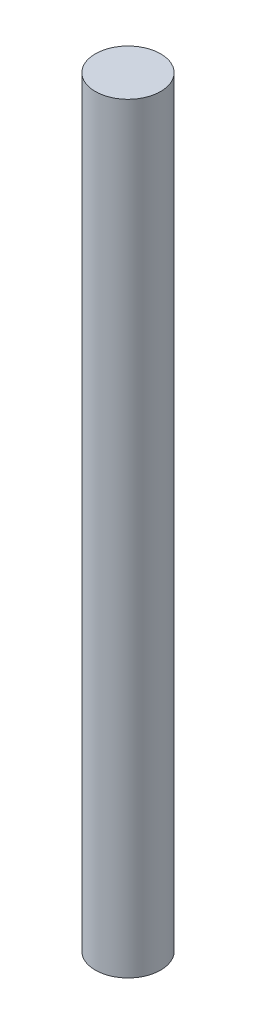
ISO-10303-21;
HEADER;
FILE_DESCRIPTION(('STEP AP214'),'2;1');
FILE_NAME('part.step','',(''),(''),'','','');
FILE_SCHEMA(('AUTOMOTIVE_DESIGN { 1 0 10303 214 1 1 1 1 }'));
ENDSEC;
DATA;
#1=APPLICATION_CONTEXT('core data for automotive mechanical design processes');
#2=APPLICATION_PROTOCOL_DEFINITION('international standard','automotive_design',2000,#1);
#3=PRODUCT_CONTEXT('',#1,'mechanical');
#4=PRODUCT('Part','Part','',(#3));
#5=PRODUCT_RELATED_PRODUCT_CATEGORY('part','',(#4));
#6=PRODUCT_DEFINITION_FORMATION('','',#4);
#7=PRODUCT_DEFINITION_CONTEXT('part definition',#1,'design');
#8=PRODUCT_DEFINITION('design','',#6,#7);
#9=PRODUCT_DEFINITION_SHAPE('','',#8);
#10=(LENGTH_UNIT() NAMED_UNIT(*) SI_UNIT(.MILLI.,.METRE.));
#11=(NAMED_UNIT(*) PLANE_ANGLE_UNIT() SI_UNIT($,.RADIAN.));
#12=(NAMED_UNIT(*) SI_UNIT($,.STERADIAN.) SOLID_ANGLE_UNIT());
#13=UNCERTAINTY_MEASURE_WITH_UNIT(LENGTH_MEASURE(1.E-05),#10,'distance_accuracy_value','');
#14=(GEOMETRIC_REPRESENTATION_CONTEXT(3) GLOBAL_UNCERTAINTY_ASSIGNED_CONTEXT((#13)) GLOBAL_UNIT_ASSIGNED_CONTEXT((#10,
#11,#12)) REPRESENTATION_CONTEXT('',''));
#15=CARTESIAN_POINT('',(0.,0.,0.));
#16=DIRECTION('',(0.,0.,1.));
#17=DIRECTION('',(1.,0.,0.));
#18=AXIS2_PLACEMENT_3D('',#15,#16,#17);
#19=CARTESIAN_POINT('',(0.,37.,0.));
#20=DIRECTION('',(0.,-1.,0.));
#21=DIRECTION('',(0.,0.,-1.));
#22=AXIS2_PLACEMENT_3D('',#19,#20,#21);
#23=CYLINDRICAL_SURFACE('',#22,1.5875);
#24=CARTESIAN_POINT('',(0.,37.,0.));
#25=DIRECTION('',(0.,1.,0.));
#26=DIRECTION('',(0.,0.,1.));
#27=AXIS2_PLACEMENT_3D('',#24,#25,#26);
#28=CIRCLE('',#27,1.5875);
#29=CARTESIAN_POINT('',(0.,37.,1.5875));
#30=VERTEX_POINT('',#29);
#31=EDGE_CURVE('E10',#30,#30,#28,.T.);
#32=ORIENTED_EDGE('',*,*,#31,.F.);
#33=EDGE_LOOP('',(#32));
#34=FACE_BOUND('',#33,.T.);
#35=CARTESIAN_POINT('',(0.,0.,0.));
#36=DIRECTION('',(0.,1.,0.));
#37=DIRECTION('',(0.,0.,1.));
#38=AXIS2_PLACEMENT_3D('',#35,#36,#37);
#39=CIRCLE('',#38,1.5875);
#40=CARTESIAN_POINT('',(0.,0.,1.5875));
#41=VERTEX_POINT('',#40);
#42=EDGE_CURVE('E37',#41,#41,#39,.T.);
#43=ORIENTED_EDGE('',*,*,#42,.T.);
#44=EDGE_LOOP('',(#43));
#45=FACE_BOUND('',#44,.T.);
#46=ADVANCED_FACE('F34',(#34,#45),#23,.T.);
#47=CARTESIAN_POINT('',(0.,37.,0.));
#48=DIRECTION('',(0.,1.,0.));
#49=DIRECTION('',(0.,0.,1.));
#50=AXIS2_PLACEMENT_3D('',#47,#48,#49);
#51=PLANE('',#50);
#52=ORIENTED_EDGE('',*,*,#31,.T.);
#53=EDGE_LOOP('',(#52));
#54=FACE_BOUND('',#53,.T.);
#55=ADVANCED_FACE('F49',(#54),#51,.T.);
#56=CARTESIAN_POINT('',(0.,0.,0.));
#57=DIRECTION('',(0.,1.,0.));
#58=DIRECTION('',(0.,0.,1.));
#59=AXIS2_PLACEMENT_3D('',#56,#57,#58);
#60=PLANE('',#59);
#61=ORIENTED_EDGE('',*,*,#42,.F.);
#62=EDGE_LOOP('',(#61));
#63=FACE_BOUND('',#62,.T.);
#64=ADVANCED_FACE('F47',(#63),#60,.F.);
#65=CLOSED_SHELL('',(#46,#55,#64));
#66=MANIFOLD_SOLID_BREP('B2',#65);
#67=ADVANCED_BREP_SHAPE_REPRESENTATION('',(#18,#66),#14);
#68=SHAPE_DEFINITION_REPRESENTATION(#9,#67);
ENDSEC;
END-ISO-10303-21;
